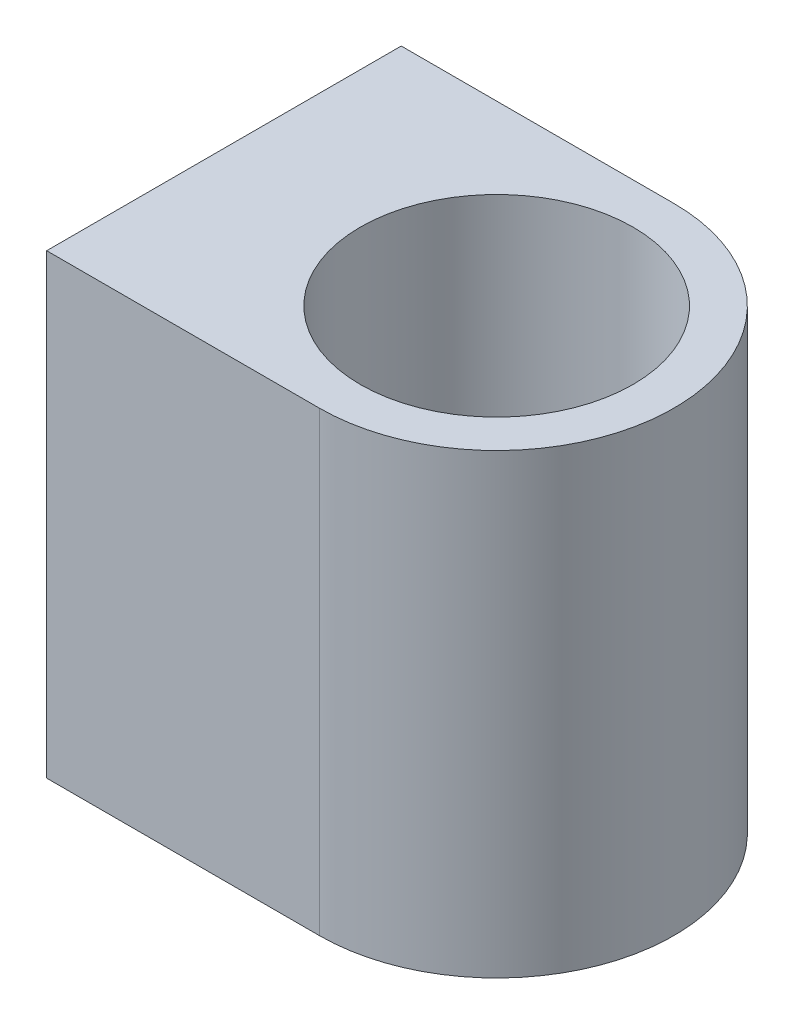
ISO-10303-21;
HEADER;
FILE_DESCRIPTION(('STEP AP214'),'2;1');
FILE_NAME('part.step','',(''),(''),'','','');
FILE_SCHEMA(('AUTOMOTIVE_DESIGN { 1 0 10303 214 1 1 1 1 }'));
ENDSEC;
DATA;
#1=APPLICATION_CONTEXT('core data for automotive mechanical design processes');
#2=APPLICATION_PROTOCOL_DEFINITION('international standard','automotive_design',2000,#1);
#3=PRODUCT_CONTEXT('',#1,'mechanical');
#4=PRODUCT('Part','Part','',(#3));
#5=PRODUCT_RELATED_PRODUCT_CATEGORY('part','',(#4));
#6=PRODUCT_DEFINITION_FORMATION('','',#4);
#7=PRODUCT_DEFINITION_CONTEXT('part definition',#1,'design');
#8=PRODUCT_DEFINITION('design','',#6,#7);
#9=PRODUCT_DEFINITION_SHAPE('','',#8);
#10=(LENGTH_UNIT() NAMED_UNIT(*) SI_UNIT(.MILLI.,.METRE.));
#11=(NAMED_UNIT(*) PLANE_ANGLE_UNIT() SI_UNIT($,.RADIAN.));
#12=(NAMED_UNIT(*) SI_UNIT($,.STERADIAN.) SOLID_ANGLE_UNIT());
#13=UNCERTAINTY_MEASURE_WITH_UNIT(LENGTH_MEASURE(1.E-05),#10,'distance_accuracy_value','');
#14=(GEOMETRIC_REPRESENTATION_CONTEXT(3) GLOBAL_UNCERTAINTY_ASSIGNED_CONTEXT((#13)) GLOBAL_UNIT_ASSIGNED_CONTEXT((#10,
#11,#12)) REPRESENTATION_CONTEXT('',''));
#15=CARTESIAN_POINT('',(0.,0.,0.));
#16=DIRECTION('',(0.,0.,1.));
#17=DIRECTION('',(1.,0.,0.));
#18=AXIS2_PLACEMENT_3D('',#15,#16,#17);
#19=CARTESIAN_POINT('',(0.,-33.5,0.));
#20=DIRECTION('',(-1.,0.,0.));
#21=DIRECTION('',(0.,0.,1.));
#22=AXIS2_PLACEMENT_3D('',#19,#20,#21);
#23=PLANE('',#22);
#24=DIRECTION('',(0.,0.,1.));
#25=VECTOR('',#24,1.);
#26=CARTESIAN_POINT('',(0.,0.,0.));
#27=LINE('',#26,#25);
#28=CARTESIAN_POINT('',(0.,0.,-13.));
#29=VERTEX_POINT('',#28);
#30=CARTESIAN_POINT('',(0.,0.,13.));
#31=VERTEX_POINT('',#30);
#32=EDGE_CURVE('E93',#29,#31,#27,.T.);
#33=ORIENTED_EDGE('',*,*,#32,.F.);
#34=DIRECTION('',(0.,1.,0.));
#35=VECTOR('',#34,1.);
#36=CARTESIAN_POINT('',(0.,-33.5,-13.));
#37=LINE('',#36,#35);
#38=CARTESIAN_POINT('',(0.,-33.5,-13.));
#39=VERTEX_POINT('',#38);
#40=EDGE_CURVE('E11',#39,#29,#37,.T.);
#41=ORIENTED_EDGE('',*,*,#40,.F.);
#42=DIRECTION('',(0.,0.,1.));
#43=VECTOR('',#42,1.);
#44=CARTESIAN_POINT('',(0.,-33.5,0.));
#45=LINE('',#44,#43);
#46=CARTESIAN_POINT('',(0.,-33.5,13.));
#47=VERTEX_POINT('',#46);
#48=EDGE_CURVE('E52',#39,#47,#45,.T.);
#49=ORIENTED_EDGE('',*,*,#48,.T.);
#50=DIRECTION('',(0.,1.,0.));
#51=VECTOR('',#50,1.);
#52=CARTESIAN_POINT('',(0.,-33.5,13.));
#53=LINE('',#52,#51);
#54=EDGE_CURVE('E37',#47,#31,#53,.T.);
#55=ORIENTED_EDGE('',*,*,#54,.T.);
#56=EDGE_LOOP('',(#33,#41,#49,#55));
#57=FACE_BOUND('',#56,.T.);
#58=ADVANCED_FACE('F33',(#57),#23,.T.);
#59=CARTESIAN_POINT('',(0.,-33.5,-13.));
#60=DIRECTION('',(0.,0.,-1.));
#61=DIRECTION('',(-1.,0.,0.));
#62=AXIS2_PLACEMENT_3D('',#59,#60,#61);
#63=PLANE('',#62);
#64=DIRECTION('',(-1.,0.,0.));
#65=VECTOR('',#64,1.);
#66=CARTESIAN_POINT('',(0.,0.,-13.));
#67=LINE('',#66,#65);
#68=CARTESIAN_POINT('',(20.,0.,-13.));
#69=VERTEX_POINT('',#68);
#70=EDGE_CURVE('E102',#69,#29,#67,.T.);
#71=ORIENTED_EDGE('',*,*,#70,.F.);
#72=DIRECTION('',(0.,1.,0.));
#73=VECTOR('',#72,1.);
#74=CARTESIAN_POINT('',(20.,-33.5,-13.));
#75=LINE('',#74,#73);
#76=CARTESIAN_POINT('',(20.,-33.5,-13.));
#77=VERTEX_POINT('',#76);
#78=EDGE_CURVE('E43',#77,#69,#75,.T.);
#79=ORIENTED_EDGE('',*,*,#78,.F.);
#80=DIRECTION('',(-1.,0.,0.));
#81=VECTOR('',#80,1.);
#82=CARTESIAN_POINT('',(0.,-33.5,-13.));
#83=LINE('',#82,#81);
#84=EDGE_CURVE('E90',#77,#39,#83,.T.);
#85=ORIENTED_EDGE('',*,*,#84,.T.);
#86=ORIENTED_EDGE('',*,*,#40,.T.);
#87=EDGE_LOOP('',(#71,#79,#85,#86));
#88=FACE_BOUND('',#87,.T.);
#89=ADVANCED_FACE('F109',(#88),#63,.T.);
#90=CARTESIAN_POINT('',(20.,-33.5,0.));
#91=DIRECTION('',(0.,1.,0.));
#92=DIRECTION('',(0.,0.,1.));
#93=AXIS2_PLACEMENT_3D('',#90,#91,#92);
#94=CYLINDRICAL_SURFACE('',#93,13.);
#95=CARTESIAN_POINT('',(20.,0.,0.));
#96=DIRECTION('',(0.,1.,0.));
#97=DIRECTION('',(0.,0.,1.));
#98=AXIS2_PLACEMENT_3D('',#95,#96,#97);
#99=CIRCLE('',#98,13.);
#100=CARTESIAN_POINT('',(20.,0.,13.));
#101=VERTEX_POINT('',#100);
#102=EDGE_CURVE('E86',#101,#69,#99,.T.);
#103=ORIENTED_EDGE('',*,*,#102,.F.);
#104=DIRECTION('',(0.,1.,0.));
#105=VECTOR('',#104,1.);
#106=CARTESIAN_POINT('',(20.,-33.5,13.));
#107=LINE('',#106,#105);
#108=CARTESIAN_POINT('',(20.,-33.5,13.));
#109=VERTEX_POINT('',#108);
#110=EDGE_CURVE('E81',#109,#101,#107,.T.);
#111=ORIENTED_EDGE('',*,*,#110,.F.);
#112=CARTESIAN_POINT('',(20.,-33.5,0.));
#113=DIRECTION('',(0.,1.,0.));
#114=DIRECTION('',(0.,0.,1.));
#115=AXIS2_PLACEMENT_3D('',#112,#113,#114);
#116=CIRCLE('',#115,13.);
#117=EDGE_CURVE('E84',#109,#77,#116,.T.);
#118=ORIENTED_EDGE('',*,*,#117,.T.);
#119=ORIENTED_EDGE('',*,*,#78,.T.);
#120=EDGE_LOOP('',(#103,#111,#118,#119));
#121=FACE_BOUND('',#120,.T.);
#122=ADVANCED_FACE('F83',(#121),#94,.T.);
#123=CARTESIAN_POINT('',(0.,-33.5,13.));
#124=DIRECTION('',(0.,0.,1.));
#125=DIRECTION('',(1.,0.,0.));
#126=AXIS2_PLACEMENT_3D('',#123,#124,#125);
#127=PLANE('',#126);
#128=DIRECTION('',(1.,0.,0.));
#129=VECTOR('',#128,1.);
#130=CARTESIAN_POINT('',(0.,0.,13.));
#131=LINE('',#130,#129);
#132=EDGE_CURVE('E98',#31,#101,#131,.T.);
#133=ORIENTED_EDGE('',*,*,#132,.F.);
#134=ORIENTED_EDGE('',*,*,#54,.F.);
#135=DIRECTION('',(1.,0.,0.));
#136=VECTOR('',#135,1.);
#137=CARTESIAN_POINT('',(0.,-33.5,13.));
#138=LINE('',#137,#136);
#139=EDGE_CURVE('E89',#47,#109,#138,.T.);
#140=ORIENTED_EDGE('',*,*,#139,.T.);
#141=ORIENTED_EDGE('',*,*,#110,.T.);
#142=EDGE_LOOP('',(#133,#134,#140,#141));
#143=FACE_BOUND('',#142,.T.);
#144=ADVANCED_FACE('F35',(#143),#127,.T.);
#145=CARTESIAN_POINT('',(20.,-33.5,0.));
#146=DIRECTION('',(0.,1.,0.));
#147=DIRECTION('',(0.,0.,1.));
#148=AXIS2_PLACEMENT_3D('',#145,#146,#147);
#149=PLANE('',#148);
#150=CARTESIAN_POINT('',(20.,-33.5,0.));
#151=DIRECTION('',(0.,1.,0.));
#152=DIRECTION('',(0.,0.,1.));
#153=AXIS2_PLACEMENT_3D('',#150,#151,#152);
#154=CIRCLE('',#153,10.);
#155=CARTESIAN_POINT('',(20.,-33.5,10.));
#156=VERTEX_POINT('',#155);
#157=EDGE_CURVE('E100',#156,#156,#154,.T.);
#158=ORIENTED_EDGE('',*,*,#157,.T.);
#159=EDGE_LOOP('',(#158));
#160=FACE_BOUND('',#159,.T.);
#161=ORIENTED_EDGE('',*,*,#48,.F.);
#162=ORIENTED_EDGE('',*,*,#84,.F.);
#163=ORIENTED_EDGE('',*,*,#117,.F.);
#164=ORIENTED_EDGE('',*,*,#139,.F.);
#165=EDGE_LOOP('',(#161,#162,#163,#164));
#166=FACE_BOUND('',#165,.T.);
#167=ADVANCED_FACE('F88',(#160,#166),#149,.F.);
#168=CARTESIAN_POINT('',(20.,0.,0.));
#169=DIRECTION('',(0.,1.,0.));
#170=DIRECTION('',(0.,0.,1.));
#171=AXIS2_PLACEMENT_3D('',#168,#169,#170);
#172=PLANE('',#171);
#173=CARTESIAN_POINT('',(20.,0.,0.));
#174=DIRECTION('',(0.,1.,0.));
#175=DIRECTION('',(0.,0.,1.));
#176=AXIS2_PLACEMENT_3D('',#173,#174,#175);
#177=CIRCLE('',#176,10.);
#178=CARTESIAN_POINT('',(20.,0.,10.));
#179=VERTEX_POINT('',#178);
#180=EDGE_CURVE('E134',#179,#179,#177,.T.);
#181=ORIENTED_EDGE('',*,*,#180,.F.);
#182=EDGE_LOOP('',(#181));
#183=FACE_BOUND('',#182,.T.);
#184=ORIENTED_EDGE('',*,*,#32,.T.);
#185=ORIENTED_EDGE('',*,*,#132,.T.);
#186=ORIENTED_EDGE('',*,*,#102,.T.);
#187=ORIENTED_EDGE('',*,*,#70,.T.);
#188=EDGE_LOOP('',(#184,#185,#186,#187));
#189=FACE_BOUND('',#188,.T.);
#190=ADVANCED_FACE('F107',(#183,#189),#172,.T.);
#191=CARTESIAN_POINT('',(20.,-33.5,0.));
#192=DIRECTION('',(0.,1.,0.));
#193=DIRECTION('',(0.,0.,1.));
#194=AXIS2_PLACEMENT_3D('',#191,#192,#193);
#195=CYLINDRICAL_SURFACE('',#194,10.);
#196=ORIENTED_EDGE('',*,*,#157,.F.);
#197=EDGE_LOOP('',(#196));
#198=FACE_BOUND('',#197,.T.);
#199=ORIENTED_EDGE('',*,*,#180,.T.);
#200=EDGE_LOOP('',(#199));
#201=FACE_BOUND('',#200,.T.);
#202=ADVANCED_FACE('F120',(#198,#201),#195,.F.);
#203=CLOSED_SHELL('',(#58,#89,#122,#144,#167,#190,#202));
#204=MANIFOLD_SOLID_BREP('B2',#203);
#205=ADVANCED_BREP_SHAPE_REPRESENTATION('',(#18,#204),#14);
#206=SHAPE_DEFINITION_REPRESENTATION(#9,#205);
ENDSEC;
END-ISO-10303-21;
